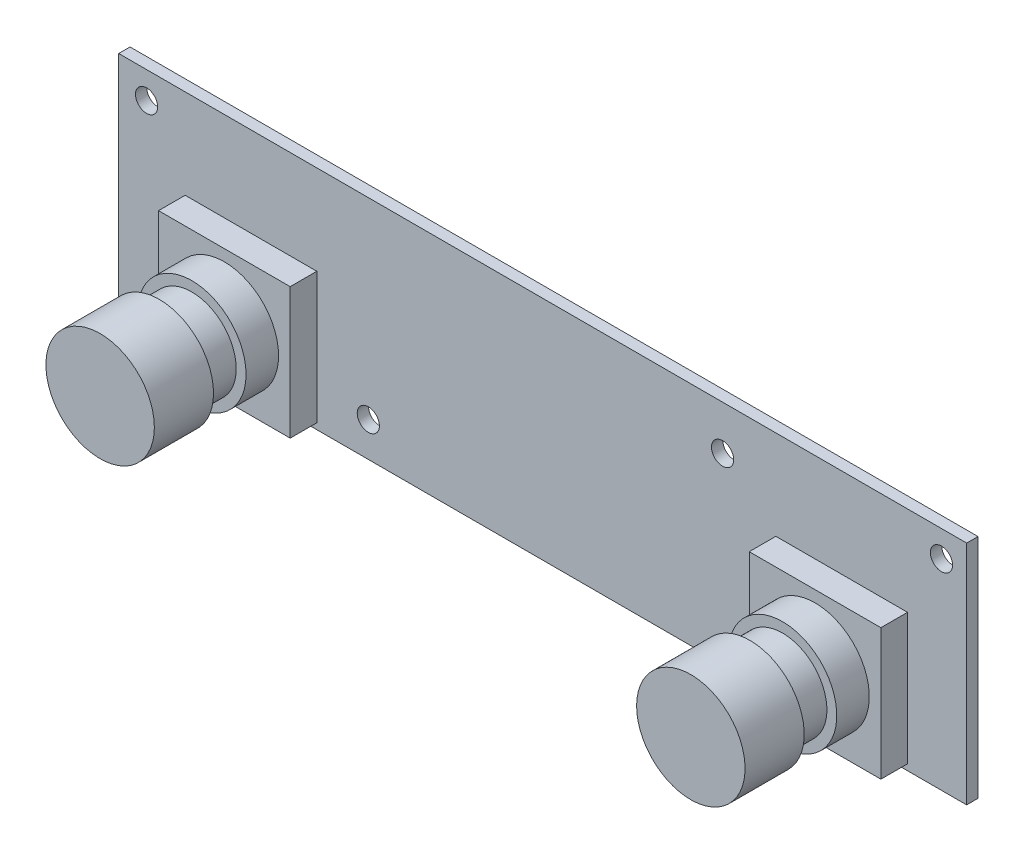
ISO-10303-21;
HEADER;
FILE_DESCRIPTION(('STEP AP214'),'2;1');
FILE_NAME('part.step','',(''),(''),'','','');
FILE_SCHEMA(('AUTOMOTIVE_DESIGN { 1 0 10303 214 1 1 1 1 }'));
ENDSEC;
DATA;
#1=APPLICATION_CONTEXT('core data for automotive mechanical design processes');
#2=APPLICATION_PROTOCOL_DEFINITION('international standard','automotive_design',2000,#1);
#3=PRODUCT_CONTEXT('',#1,'mechanical');
#4=PRODUCT('Part','Part','',(#3));
#5=PRODUCT_RELATED_PRODUCT_CATEGORY('part','',(#4));
#6=PRODUCT_DEFINITION_FORMATION('','',#4);
#7=PRODUCT_DEFINITION_CONTEXT('part definition',#1,'design');
#8=PRODUCT_DEFINITION('design','',#6,#7);
#9=PRODUCT_DEFINITION_SHAPE('','',#8);
#10=(LENGTH_UNIT() NAMED_UNIT(*) SI_UNIT(.MILLI.,.METRE.));
#11=(NAMED_UNIT(*) PLANE_ANGLE_UNIT() SI_UNIT($,.RADIAN.));
#12=(NAMED_UNIT(*) SI_UNIT($,.STERADIAN.) SOLID_ANGLE_UNIT());
#13=UNCERTAINTY_MEASURE_WITH_UNIT(LENGTH_MEASURE(1.E-05),#10,'distance_accuracy_value','');
#14=(GEOMETRIC_REPRESENTATION_CONTEXT(3) GLOBAL_UNCERTAINTY_ASSIGNED_CONTEXT((#13)) GLOBAL_UNIT_ASSIGNED_CONTEXT((#10,
#11,#12)) REPRESENTATION_CONTEXT('',''));
#15=CARTESIAN_POINT('',(0.,0.,0.));
#16=DIRECTION('',(0.,0.,1.));
#17=DIRECTION('',(1.,0.,0.));
#18=AXIS2_PLACEMENT_3D('',#15,#16,#17);
#19=CARTESIAN_POINT('',(0.,0.,0.));
#20=DIRECTION('',(0.,0.,1.));
#21=DIRECTION('',(1.,0.,0.));
#22=AXIS2_PLACEMENT_3D('',#19,#20,#21);
#23=PLANE('',#22);
#24=CARTESIAN_POINT('',(-40.175,8.775,0.));
#25=DIRECTION('',(0.,0.,1.));
#26=DIRECTION('',(1.,0.,0.));
#27=AXIS2_PLACEMENT_3D('',#24,#25,#26);
#28=CIRCLE('',#27,1.125);
#29=CARTESIAN_POINT('',(-39.05,8.775,0.));
#30=VERTEX_POINT('',#29);
#31=EDGE_CURVE('E310',#30,#30,#28,.T.);
#32=ORIENTED_EDGE('',*,*,#31,.F.);
#33=EDGE_LOOP('',(#32));
#34=FACE_BOUND('',#33,.T.);
#35=CARTESIAN_POINT('',(-17.685,-7.995,0.));
#36=DIRECTION('',(0.,0.,1.));
#37=DIRECTION('',(1.,0.,0.));
#38=AXIS2_PLACEMENT_3D('',#35,#36,#37);
#39=CIRCLE('',#38,1.125);
#40=CARTESIAN_POINT('',(-16.56,-7.995,0.));
#41=VERTEX_POINT('',#40);
#42=EDGE_CURVE('E314',#41,#41,#39,.T.);
#43=ORIENTED_EDGE('',*,*,#42,.F.);
#44=EDGE_LOOP('',(#43));
#45=FACE_BOUND('',#44,.T.);
#46=CARTESIAN_POINT('',(18.245,6.995,0.));
#47=DIRECTION('',(0.,0.,1.));
#48=DIRECTION('',(1.,0.,0.));
#49=AXIS2_PLACEMENT_3D('',#46,#47,#48);
#50=CIRCLE('',#49,1.125);
#51=CARTESIAN_POINT('',(19.37,6.995,0.));
#52=VERTEX_POINT('',#51);
#53=EDGE_CURVE('E318',#52,#52,#50,.T.);
#54=ORIENTED_EDGE('',*,*,#53,.F.);
#55=EDGE_LOOP('',(#54));
#56=FACE_BOUND('',#55,.T.);
#57=CARTESIAN_POINT('',(40.445,8.83576446590219,0.));
#58=DIRECTION('',(0.,0.,1.));
#59=DIRECTION('',(1.,0.,0.));
#60=AXIS2_PLACEMENT_3D('',#57,#58,#59);
#61=CIRCLE('',#60,1.125);
#62=CARTESIAN_POINT('',(41.57,8.83576446590219,0.));
#63=VERTEX_POINT('',#62);
#64=EDGE_CURVE('E322',#63,#63,#61,.T.);
#65=ORIENTED_EDGE('',*,*,#64,.F.);
#66=EDGE_LOOP('',(#65));
#67=FACE_BOUND('',#66,.T.);
#68=DIRECTION('',(1.,0.,0.));
#69=VECTOR('',#68,1.);
#70=CARTESIAN_POINT('',(-43.,11.5,0.));
#71=LINE('',#70,#69);
#72=CARTESIAN_POINT('',(-43.,11.5,0.));
#73=VERTEX_POINT('',#72);
#74=CARTESIAN_POINT('',(43.,11.5,0.));
#75=VERTEX_POINT('',#74);
#76=EDGE_CURVE('E204',#73,#75,#71,.T.);
#77=ORIENTED_EDGE('',*,*,#76,.F.);
#78=DIRECTION('',(0.,1.,0.));
#79=VECTOR('',#78,1.);
#80=CARTESIAN_POINT('',(-43.,-11.5,0.));
#81=LINE('',#80,#79);
#82=CARTESIAN_POINT('',(-43.,-11.5,0.));
#83=VERTEX_POINT('',#82);
#84=EDGE_CURVE('E209',#83,#73,#81,.T.);
#85=ORIENTED_EDGE('',*,*,#84,.F.);
#86=DIRECTION('',(1.,0.,0.));
#87=VECTOR('',#86,1.);
#88=CARTESIAN_POINT('',(-43.,-11.5,0.));
#89=LINE('',#88,#87);
#90=CARTESIAN_POINT('',(43.,-11.5,0.));
#91=VERTEX_POINT('',#90);
#92=EDGE_CURVE('E228',#83,#91,#89,.T.);
#93=ORIENTED_EDGE('',*,*,#92,.T.);
#94=DIRECTION('',(0.,1.,0.));
#95=VECTOR('',#94,1.);
#96=CARTESIAN_POINT('',(43.,-11.5,0.));
#97=LINE('',#96,#95);
#98=EDGE_CURVE('E224',#91,#75,#97,.T.);
#99=ORIENTED_EDGE('',*,*,#98,.T.);
#100=EDGE_LOOP('',(#77,#85,#93,#99));
#101=FACE_BOUND('',#100,.T.);
#102=DIRECTION('',(1.,0.,0.));
#103=VECTOR('',#102,1.);
#104=CARTESIAN_POINT('',(23.65,-10.8921619139473,0.));
#105=LINE('',#104,#103);
#106=CARTESIAN_POINT('',(23.65,-10.8921619139473,0.));
#107=VERTEX_POINT('',#106);
#108=CARTESIAN_POINT('',(37.,-10.8921619139473,0.));
#109=VERTEX_POINT('',#108);
#110=EDGE_CURVE('E165',#107,#109,#105,.T.);
#111=ORIENTED_EDGE('',*,*,#110,.F.);
#112=DIRECTION('',(0.,-1.,0.));
#113=VECTOR('',#112,1.);
#114=CARTESIAN_POINT('',(23.65,2.41783808605268,0.));
#115=LINE('',#114,#113);
#116=CARTESIAN_POINT('',(23.65,2.41783808605268,0.));
#117=VERTEX_POINT('',#116);
#118=EDGE_CURVE('E160',#117,#107,#115,.T.);
#119=ORIENTED_EDGE('',*,*,#118,.F.);
#120=DIRECTION('',(-1.,0.,0.));
#121=VECTOR('',#120,1.);
#122=CARTESIAN_POINT('',(23.65,2.41783808605268,0.));
#123=LINE('',#122,#121);
#124=CARTESIAN_POINT('',(37.,2.41783808605268,0.));
#125=VERTEX_POINT('',#124);
#126=EDGE_CURVE('E175',#125,#117,#123,.T.);
#127=ORIENTED_EDGE('',*,*,#126,.F.);
#128=DIRECTION('',(0.,1.,0.));
#129=VECTOR('',#128,1.);
#130=CARTESIAN_POINT('',(37.,2.41783808605268,0.));
#131=LINE('',#130,#129);
#132=EDGE_CURVE('E187',#109,#125,#131,.T.);
#133=ORIENTED_EDGE('',*,*,#132,.F.);
#134=EDGE_LOOP('',(#111,#119,#127,#133));
#135=FACE_BOUND('',#134,.T.);
#136=DIRECTION('',(1.,0.,0.));
#137=VECTOR('',#136,1.);
#138=CARTESIAN_POINT('',(-36.26,-10.8921619139473,0.));
#139=LINE('',#138,#137);
#140=CARTESIAN_POINT('',(-36.26,-10.8921619139473,0.));
#141=VERTEX_POINT('',#140);
#142=CARTESIAN_POINT('',(-22.91,-10.8921619139473,0.));
#143=VERTEX_POINT('',#142);
#144=EDGE_CURVE('E262',#141,#143,#139,.T.);
#145=ORIENTED_EDGE('',*,*,#144,.F.);
#146=DIRECTION('',(0.,-1.,0.));
#147=VECTOR('',#146,1.);
#148=CARTESIAN_POINT('',(-36.26,2.41783808605268,0.));
#149=LINE('',#148,#147);
#150=CARTESIAN_POINT('',(-36.26,2.41783808605268,0.));
#151=VERTEX_POINT('',#150);
#152=EDGE_CURVE('E157',#151,#141,#149,.T.);
#153=ORIENTED_EDGE('',*,*,#152,.F.);
#154=DIRECTION('',(-1.,0.,0.));
#155=VECTOR('',#154,1.);
#156=CARTESIAN_POINT('',(-36.26,2.41783808605268,0.));
#157=LINE('',#156,#155);
#158=CARTESIAN_POINT('',(-22.91,2.41783808605268,0.));
#159=VERTEX_POINT('',#158);
#160=EDGE_CURVE('E153',#159,#151,#157,.T.);
#161=ORIENTED_EDGE('',*,*,#160,.F.);
#162=DIRECTION('',(0.,1.,0.));
#163=VECTOR('',#162,1.);
#164=CARTESIAN_POINT('',(-22.91,2.41783808605268,0.));
#165=LINE('',#164,#163);
#166=EDGE_CURVE('E265',#143,#159,#165,.T.);
#167=ORIENTED_EDGE('',*,*,#166,.F.);
#168=EDGE_LOOP('',(#145,#153,#161,#167));
#169=FACE_BOUND('',#168,.T.);
#170=ADVANCED_FACE('F39',(#34,#45,#56,#67,#101,#135,#169),#23,.T.);
#171=CARTESIAN_POINT('',(-43.,11.5,-1.15));
#172=DIRECTION('',(0.,-1.,0.));
#173=DIRECTION('',(0.,0.,-1.));
#174=AXIS2_PLACEMENT_3D('',#171,#172,#173);
#175=PLANE('',#174);
#176=ORIENTED_EDGE('',*,*,#76,.T.);
#177=DIRECTION('',(0.,0.,1.));
#178=VECTOR('',#177,1.);
#179=CARTESIAN_POINT('',(43.,11.5,-1.15));
#180=LINE('',#179,#178);
#181=CARTESIAN_POINT('',(43.,11.5,-1.15));
#182=VERTEX_POINT('',#181);
#183=EDGE_CURVE('E43',#182,#75,#180,.T.);
#184=ORIENTED_EDGE('',*,*,#183,.F.);
#185=DIRECTION('',(1.,0.,0.));
#186=VECTOR('',#185,1.);
#187=CARTESIAN_POINT('',(-43.,11.5,-1.15));
#188=LINE('',#187,#186);
#189=CARTESIAN_POINT('',(-43.,11.5,-1.15));
#190=VERTEX_POINT('',#189);
#191=EDGE_CURVE('E205',#190,#182,#188,.T.);
#192=ORIENTED_EDGE('',*,*,#191,.F.);
#193=DIRECTION('',(0.,0.,1.));
#194=VECTOR('',#193,1.);
#195=CARTESIAN_POINT('',(-43.,11.5,-1.15));
#196=LINE('',#195,#194);
#197=EDGE_CURVE('E220',#190,#73,#196,.T.);
#198=ORIENTED_EDGE('',*,*,#197,.T.);
#199=EDGE_LOOP('',(#176,#184,#192,#198));
#200=FACE_BOUND('',#199,.T.);
#201=ADVANCED_FACE('F41',(#200),#175,.F.);
#202=CARTESIAN_POINT('',(43.,-11.5,-1.15));
#203=DIRECTION('',(1.,0.,0.));
#204=DIRECTION('',(0.,0.,-1.));
#205=AXIS2_PLACEMENT_3D('',#202,#203,#204);
#206=PLANE('',#205);
#207=ORIENTED_EDGE('',*,*,#98,.F.);
#208=DIRECTION('',(0.,0.,1.));
#209=VECTOR('',#208,1.);
#210=CARTESIAN_POINT('',(43.,-11.5,-1.15));
#211=LINE('',#210,#209);
#212=CARTESIAN_POINT('',(43.,-11.5,-1.15));
#213=VERTEX_POINT('',#212);
#214=EDGE_CURVE('E239',#213,#91,#211,.T.);
#215=ORIENTED_EDGE('',*,*,#214,.F.);
#216=DIRECTION('',(0.,1.,0.));
#217=VECTOR('',#216,1.);
#218=CARTESIAN_POINT('',(43.,-11.5,-1.15));
#219=LINE('',#218,#217);
#220=EDGE_CURVE('E208',#213,#182,#219,.T.);
#221=ORIENTED_EDGE('',*,*,#220,.T.);
#222=ORIENTED_EDGE('',*,*,#183,.T.);
#223=EDGE_LOOP('',(#207,#215,#221,#222));
#224=FACE_BOUND('',#223,.T.);
#225=ADVANCED_FACE('F360',(#224),#206,.T.);
#226=CARTESIAN_POINT('',(-43.,-11.5,-1.15));
#227=DIRECTION('',(0.,-1.,0.));
#228=DIRECTION('',(0.,0.,-1.));
#229=AXIS2_PLACEMENT_3D('',#226,#227,#228);
#230=PLANE('',#229);
#231=ORIENTED_EDGE('',*,*,#92,.F.);
#232=DIRECTION('',(0.,0.,1.));
#233=VECTOR('',#232,1.);
#234=CARTESIAN_POINT('',(-43.,-11.5,-1.15));
#235=LINE('',#234,#233);
#236=CARTESIAN_POINT('',(-43.,-11.5,-1.15));
#237=VERTEX_POINT('',#236);
#238=EDGE_CURVE('E237',#237,#83,#235,.T.);
#239=ORIENTED_EDGE('',*,*,#238,.F.);
#240=DIRECTION('',(1.,0.,0.));
#241=VECTOR('',#240,1.);
#242=CARTESIAN_POINT('',(-43.,-11.5,-1.15));
#243=LINE('',#242,#241);
#244=EDGE_CURVE('E213',#237,#213,#243,.T.);
#245=ORIENTED_EDGE('',*,*,#244,.T.);
#246=ORIENTED_EDGE('',*,*,#214,.T.);
#247=EDGE_LOOP('',(#231,#239,#245,#246));
#248=FACE_BOUND('',#247,.T.);
#249=ADVANCED_FACE('F364',(#248),#230,.T.);
#250=CARTESIAN_POINT('',(-43.,-11.5,-1.15));
#251=DIRECTION('',(1.,0.,0.));
#252=DIRECTION('',(0.,0.,-1.));
#253=AXIS2_PLACEMENT_3D('',#250,#251,#252);
#254=PLANE('',#253);
#255=ORIENTED_EDGE('',*,*,#84,.T.);
#256=ORIENTED_EDGE('',*,*,#197,.F.);
#257=DIRECTION('',(0.,1.,0.));
#258=VECTOR('',#257,1.);
#259=CARTESIAN_POINT('',(-43.,-11.5,-1.15));
#260=LINE('',#259,#258);
#261=EDGE_CURVE('E217',#237,#190,#260,.T.);
#262=ORIENTED_EDGE('',*,*,#261,.F.);
#263=ORIENTED_EDGE('',*,*,#238,.T.);
#264=EDGE_LOOP('',(#255,#256,#262,#263));
#265=FACE_BOUND('',#264,.T.);
#266=ADVANCED_FACE('F350',(#265),#254,.F.);
#267=CARTESIAN_POINT('',(0.,0.,-1.15));
#268=DIRECTION('',(0.,0.,1.));
#269=DIRECTION('',(1.,0.,0.));
#270=AXIS2_PLACEMENT_3D('',#267,#268,#269);
#271=PLANE('',#270);
#272=CARTESIAN_POINT('',(-40.175,8.775,-1.15));
#273=DIRECTION('',(0.,0.,-1.));
#274=DIRECTION('',(-1.,0.,0.));
#275=AXIS2_PLACEMENT_3D('',#272,#273,#274);
#276=CIRCLE('',#275,1.125);
#277=CARTESIAN_POINT('',(-41.3,8.775,-1.15));
#278=VERTEX_POINT('',#277);
#279=EDGE_CURVE('E326',#278,#278,#276,.T.);
#280=ORIENTED_EDGE('',*,*,#279,.F.);
#281=EDGE_LOOP('',(#280));
#282=FACE_BOUND('',#281,.T.);
#283=CARTESIAN_POINT('',(-17.685,-7.995,-1.15));
#284=DIRECTION('',(0.,0.,-1.));
#285=DIRECTION('',(-1.,0.,0.));
#286=AXIS2_PLACEMENT_3D('',#283,#284,#285);
#287=CIRCLE('',#286,1.125);
#288=CARTESIAN_POINT('',(-18.81,-7.995,-1.15));
#289=VERTEX_POINT('',#288);
#290=EDGE_CURVE('E330',#289,#289,#287,.T.);
#291=ORIENTED_EDGE('',*,*,#290,.F.);
#292=EDGE_LOOP('',(#291));
#293=FACE_BOUND('',#292,.T.);
#294=CARTESIAN_POINT('',(18.245,6.995,-1.15));
#295=DIRECTION('',(0.,0.,-1.));
#296=DIRECTION('',(-1.,0.,0.));
#297=AXIS2_PLACEMENT_3D('',#294,#295,#296);
#298=CIRCLE('',#297,1.125);
#299=CARTESIAN_POINT('',(17.12,6.995,-1.15));
#300=VERTEX_POINT('',#299);
#301=EDGE_CURVE('E334',#300,#300,#298,.T.);
#302=ORIENTED_EDGE('',*,*,#301,.F.);
#303=EDGE_LOOP('',(#302));
#304=FACE_BOUND('',#303,.T.);
#305=CARTESIAN_POINT('',(40.445,8.83576446590219,-1.15));
#306=DIRECTION('',(0.,0.,-1.));
#307=DIRECTION('',(-1.,0.,0.));
#308=AXIS2_PLACEMENT_3D('',#305,#306,#307);
#309=CIRCLE('',#308,1.125);
#310=CARTESIAN_POINT('',(39.32,8.83576446590219,-1.15));
#311=VERTEX_POINT('',#310);
#312=EDGE_CURVE('E338',#311,#311,#309,.T.);
#313=ORIENTED_EDGE('',*,*,#312,.F.);
#314=EDGE_LOOP('',(#313));
#315=FACE_BOUND('',#314,.T.);
#316=ORIENTED_EDGE('',*,*,#191,.T.);
#317=ORIENTED_EDGE('',*,*,#220,.F.);
#318=ORIENTED_EDGE('',*,*,#244,.F.);
#319=ORIENTED_EDGE('',*,*,#261,.T.);
#320=EDGE_LOOP('',(#316,#317,#318,#319));
#321=FACE_BOUND('',#320,.T.);
#322=ADVANCED_FACE('F346',(#282,#293,#304,#315,#321),#271,.F.);
#323=CARTESIAN_POINT('',(23.65,2.41783808605268,2.7));
#324=DIRECTION('',(1.,0.,0.));
#325=DIRECTION('',(0.,0.,-1.));
#326=AXIS2_PLACEMENT_3D('',#323,#324,#325);
#327=PLANE('',#326);
#328=ORIENTED_EDGE('',*,*,#118,.T.);
#329=DIRECTION('',(0.,0.,-1.));
#330=VECTOR('',#329,1.);
#331=CARTESIAN_POINT('',(23.65,-10.8921619139473,2.7));
#332=LINE('',#331,#330);
#333=CARTESIAN_POINT('',(23.65,-10.8921619139473,2.7));
#334=VERTEX_POINT('',#333);
#335=EDGE_CURVE('E201',#334,#107,#332,.T.);
#336=ORIENTED_EDGE('',*,*,#335,.F.);
#337=DIRECTION('',(0.,-1.,0.));
#338=VECTOR('',#337,1.);
#339=CARTESIAN_POINT('',(23.65,2.41783808605268,2.7));
#340=LINE('',#339,#338);
#341=CARTESIAN_POINT('',(23.65,2.41783808605268,2.7));
#342=VERTEX_POINT('',#341);
#343=EDGE_CURVE('E170',#342,#334,#340,.T.);
#344=ORIENTED_EDGE('',*,*,#343,.F.);
#345=DIRECTION('',(0.,0.,-1.));
#346=VECTOR('',#345,1.);
#347=CARTESIAN_POINT('',(23.65,2.41783808605268,2.7));
#348=LINE('',#347,#346);
#349=EDGE_CURVE('E183',#342,#117,#348,.T.);
#350=ORIENTED_EDGE('',*,*,#349,.T.);
#351=EDGE_LOOP('',(#328,#336,#344,#350));
#352=FACE_BOUND('',#351,.T.);
#353=ADVANCED_FACE('F349',(#352),#327,.F.);
#354=CARTESIAN_POINT('',(23.65,-10.8921619139473,2.7));
#355=DIRECTION('',(0.,1.,0.));
#356=DIRECTION('',(0.,0.,1.));
#357=AXIS2_PLACEMENT_3D('',#354,#355,#356);
#358=PLANE('',#357);
#359=ORIENTED_EDGE('',*,*,#110,.T.);
#360=DIRECTION('',(0.,0.,-1.));
#361=VECTOR('',#360,1.);
#362=CARTESIAN_POINT('',(37.,-10.8921619139473,2.7));
#363=LINE('',#362,#361);
#364=CARTESIAN_POINT('',(37.,-10.8921619139473,2.7));
#365=VERTEX_POINT('',#364);
#366=EDGE_CURVE('E197',#365,#109,#363,.T.);
#367=ORIENTED_EDGE('',*,*,#366,.F.);
#368=DIRECTION('',(1.,0.,0.));
#369=VECTOR('',#368,1.);
#370=CARTESIAN_POINT('',(23.65,-10.8921619139473,2.7));
#371=LINE('',#370,#369);
#372=EDGE_CURVE('E174',#334,#365,#371,.T.);
#373=ORIENTED_EDGE('',*,*,#372,.F.);
#374=ORIENTED_EDGE('',*,*,#335,.T.);
#375=EDGE_LOOP('',(#359,#367,#373,#374));
#376=FACE_BOUND('',#375,.T.);
#377=ADVANCED_FACE('F383',(#376),#358,.F.);
#378=CARTESIAN_POINT('',(37.,2.41783808605268,2.7));
#379=DIRECTION('',(-1.,0.,0.));
#380=DIRECTION('',(0.,0.,1.));
#381=AXIS2_PLACEMENT_3D('',#378,#379,#380);
#382=PLANE('',#381);
#383=ORIENTED_EDGE('',*,*,#132,.T.);
#384=DIRECTION('',(0.,0.,-1.));
#385=VECTOR('',#384,1.);
#386=CARTESIAN_POINT('',(37.,2.41783808605268,2.7));
#387=LINE('',#386,#385);
#388=CARTESIAN_POINT('',(37.,2.41783808605268,2.7));
#389=VERTEX_POINT('',#388);
#390=EDGE_CURVE('E65',#389,#125,#387,.T.);
#391=ORIENTED_EDGE('',*,*,#390,.F.);
#392=DIRECTION('',(0.,1.,0.));
#393=VECTOR('',#392,1.);
#394=CARTESIAN_POINT('',(37.,2.41783808605268,2.7));
#395=LINE('',#394,#393);
#396=EDGE_CURVE('E178',#365,#389,#395,.T.);
#397=ORIENTED_EDGE('',*,*,#396,.F.);
#398=ORIENTED_EDGE('',*,*,#366,.T.);
#399=EDGE_LOOP('',(#383,#391,#397,#398));
#400=FACE_BOUND('',#399,.T.);
#401=ADVANCED_FACE('F387',(#400),#382,.F.);
#402=CARTESIAN_POINT('',(23.65,2.41783808605268,2.7));
#403=DIRECTION('',(0.,-1.,0.));
#404=DIRECTION('',(1.,0.,0.));
#405=AXIS2_PLACEMENT_3D('',#402,#403,#404);
#406=PLANE('',#405);
#407=ORIENTED_EDGE('',*,*,#126,.T.);
#408=ORIENTED_EDGE('',*,*,#349,.F.);
#409=DIRECTION('',(-1.,0.,0.));
#410=VECTOR('',#409,1.);
#411=CARTESIAN_POINT('',(23.65,2.41783808605268,2.7));
#412=LINE('',#411,#410);
#413=EDGE_CURVE('E181',#389,#342,#412,.T.);
#414=ORIENTED_EDGE('',*,*,#413,.F.);
#415=ORIENTED_EDGE('',*,*,#390,.T.);
#416=EDGE_LOOP('',(#407,#408,#414,#415));
#417=FACE_BOUND('',#416,.T.);
#418=ADVANCED_FACE('F391',(#417),#406,.F.);
#419=CARTESIAN_POINT('',(0.,0.,2.7));
#420=DIRECTION('',(0.,0.,1.));
#421=DIRECTION('',(1.,0.,0.));
#422=AXIS2_PLACEMENT_3D('',#419,#420,#421);
#423=PLANE('',#422);
#424=CARTESIAN_POINT('',(30.325,-4.23716191394732,2.7));
#425=DIRECTION('',(0.,0.,-1.));
#426=DIRECTION('',(-1.,0.,0.));
#427=AXIS2_PLACEMENT_3D('',#424,#425,#426);
#428=CIRCLE('',#427,5.5);
#429=CARTESIAN_POINT('',(24.825,-4.23716191394732,2.7));
#430=VERTEX_POINT('',#429);
#431=EDGE_CURVE('E290',#430,#430,#428,.T.);
#432=ORIENTED_EDGE('',*,*,#431,.T.);
#433=EDGE_LOOP('',(#432));
#434=FACE_BOUND('',#433,.T.);
#435=ORIENTED_EDGE('',*,*,#343,.T.);
#436=ORIENTED_EDGE('',*,*,#372,.T.);
#437=ORIENTED_EDGE('',*,*,#396,.T.);
#438=ORIENTED_EDGE('',*,*,#413,.T.);
#439=EDGE_LOOP('',(#435,#436,#437,#438));
#440=FACE_BOUND('',#439,.T.);
#441=ADVANCED_FACE('F395',(#434,#440),#423,.T.);
#442=CARTESIAN_POINT('',(-36.26,2.41783808605268,2.7));
#443=DIRECTION('',(1.,0.,0.));
#444=DIRECTION('',(0.,0.,-1.));
#445=AXIS2_PLACEMENT_3D('',#442,#443,#444);
#446=PLANE('',#445);
#447=ORIENTED_EDGE('',*,*,#152,.T.);
#448=DIRECTION('',(0.,0.,-1.));
#449=VECTOR('',#448,1.);
#450=CARTESIAN_POINT('',(-36.26,-10.8921619139473,2.7));
#451=LINE('',#450,#449);
#452=CARTESIAN_POINT('',(-36.26,-10.8921619139473,2.7));
#453=VERTEX_POINT('',#452);
#454=EDGE_CURVE('E136',#453,#141,#451,.T.);
#455=ORIENTED_EDGE('',*,*,#454,.F.);
#456=DIRECTION('',(0.,-1.,0.));
#457=VECTOR('',#456,1.);
#458=CARTESIAN_POINT('',(-36.26,2.41783808605268,2.7));
#459=LINE('',#458,#457);
#460=CARTESIAN_POINT('',(-36.26,2.41783808605268,2.7));
#461=VERTEX_POINT('',#460);
#462=EDGE_CURVE('E144',#461,#453,#459,.T.);
#463=ORIENTED_EDGE('',*,*,#462,.F.);
#464=DIRECTION('',(0.,0.,-1.));
#465=VECTOR('',#464,1.);
#466=CARTESIAN_POINT('',(-36.26,2.41783808605268,2.7));
#467=LINE('',#466,#465);
#468=EDGE_CURVE('E259',#461,#151,#467,.T.);
#469=ORIENTED_EDGE('',*,*,#468,.T.);
#470=EDGE_LOOP('',(#447,#455,#463,#469));
#471=FACE_BOUND('',#470,.T.);
#472=ADVANCED_FACE('F155',(#471),#446,.F.);
#473=CARTESIAN_POINT('',(-36.26,-10.8921619139473,2.7));
#474=DIRECTION('',(0.,1.,0.));
#475=DIRECTION('',(0.,0.,1.));
#476=AXIS2_PLACEMENT_3D('',#473,#474,#475);
#477=PLANE('',#476);
#478=ORIENTED_EDGE('',*,*,#144,.T.);
#479=DIRECTION('',(0.,0.,-1.));
#480=VECTOR('',#479,1.);
#481=CARTESIAN_POINT('',(-22.91,-10.8921619139473,2.7));
#482=LINE('',#481,#480);
#483=CARTESIAN_POINT('',(-22.91,-10.8921619139473,2.7));
#484=VERTEX_POINT('',#483);
#485=EDGE_CURVE('E139',#484,#143,#482,.T.);
#486=ORIENTED_EDGE('',*,*,#485,.F.);
#487=DIRECTION('',(1.,0.,0.));
#488=VECTOR('',#487,1.);
#489=CARTESIAN_POINT('',(-36.26,-10.8921619139473,2.7));
#490=LINE('',#489,#488);
#491=EDGE_CURVE('E132',#453,#484,#490,.T.);
#492=ORIENTED_EDGE('',*,*,#491,.F.);
#493=ORIENTED_EDGE('',*,*,#454,.T.);
#494=EDGE_LOOP('',(#478,#486,#492,#493));
#495=FACE_BOUND('',#494,.T.);
#496=ADVANCED_FACE('F134',(#495),#477,.F.);
#497=CARTESIAN_POINT('',(-22.91,2.41783808605268,2.7));
#498=DIRECTION('',(-1.,0.,0.));
#499=DIRECTION('',(0.,0.,1.));
#500=AXIS2_PLACEMENT_3D('',#497,#498,#499);
#501=PLANE('',#500);
#502=ORIENTED_EDGE('',*,*,#166,.T.);
#503=DIRECTION('',(0.,0.,-1.));
#504=VECTOR('',#503,1.);
#505=CARTESIAN_POINT('',(-22.91,2.41783808605268,2.7));
#506=LINE('',#505,#504);
#507=CARTESIAN_POINT('',(-22.91,2.41783808605268,2.7));
#508=VERTEX_POINT('',#507);
#509=EDGE_CURVE('E57',#508,#159,#506,.T.);
#510=ORIENTED_EDGE('',*,*,#509,.F.);
#511=DIRECTION('',(0.,1.,0.));
#512=VECTOR('',#511,1.);
#513=CARTESIAN_POINT('',(-22.91,2.41783808605268,2.7));
#514=LINE('',#513,#512);
#515=EDGE_CURVE('E143',#484,#508,#514,.T.);
#516=ORIENTED_EDGE('',*,*,#515,.F.);
#517=ORIENTED_EDGE('',*,*,#485,.T.);
#518=EDGE_LOOP('',(#502,#510,#516,#517));
#519=FACE_BOUND('',#518,.T.);
#520=ADVANCED_FACE('F403',(#519),#501,.F.);
#521=CARTESIAN_POINT('',(-36.26,2.41783808605268,2.7));
#522=DIRECTION('',(0.,-1.,0.));
#523=DIRECTION('',(0.,0.,-1.));
#524=AXIS2_PLACEMENT_3D('',#521,#522,#523);
#525=PLANE('',#524);
#526=ORIENTED_EDGE('',*,*,#160,.T.);
#527=ORIENTED_EDGE('',*,*,#468,.F.);
#528=DIRECTION('',(-1.,0.,0.));
#529=VECTOR('',#528,1.);
#530=CARTESIAN_POINT('',(-36.26,2.41783808605268,2.7));
#531=LINE('',#530,#529);
#532=EDGE_CURVE('E148',#508,#461,#531,.T.);
#533=ORIENTED_EDGE('',*,*,#532,.F.);
#534=ORIENTED_EDGE('',*,*,#509,.T.);
#535=EDGE_LOOP('',(#526,#527,#533,#534));
#536=FACE_BOUND('',#535,.T.);
#537=ADVANCED_FACE('F406',(#536),#525,.F.);
#538=CARTESIAN_POINT('',(0.,0.,2.7));
#539=DIRECTION('',(0.,0.,1.));
#540=DIRECTION('',(1.,0.,0.));
#541=AXIS2_PLACEMENT_3D('',#538,#539,#540);
#542=PLANE('',#541);
#543=CARTESIAN_POINT('',(-29.585,-4.23716191394732,2.7));
#544=DIRECTION('',(0.,0.,1.));
#545=DIRECTION('',(1.,0.,0.));
#546=AXIS2_PLACEMENT_3D('',#543,#544,#545);
#547=CIRCLE('',#546,5.5);
#548=CARTESIAN_POINT('',(-24.085,-4.23716191394732,2.7));
#549=VERTEX_POINT('',#548);
#550=EDGE_CURVE('E49',#549,#549,#547,.T.);
#551=ORIENTED_EDGE('',*,*,#550,.F.);
#552=EDGE_LOOP('',(#551));
#553=FACE_BOUND('',#552,.T.);
#554=ORIENTED_EDGE('',*,*,#462,.T.);
#555=ORIENTED_EDGE('',*,*,#491,.T.);
#556=ORIENTED_EDGE('',*,*,#515,.T.);
#557=ORIENTED_EDGE('',*,*,#532,.T.);
#558=EDGE_LOOP('',(#554,#555,#556,#557));
#559=FACE_BOUND('',#558,.T.);
#560=ADVANCED_FACE('F147',(#553,#559),#542,.T.);
#561=CARTESIAN_POINT('',(-29.585,-4.23716191394732,6.));
#562=DIRECTION('',(0.,0.,-1.));
#563=DIRECTION('',(-1.,0.,0.));
#564=AXIS2_PLACEMENT_3D('',#561,#562,#563);
#565=CYLINDRICAL_SURFACE('',#564,5.5);
#566=CARTESIAN_POINT('',(-29.585,-4.23716191394732,6.));
#567=DIRECTION('',(0.,0.,1.));
#568=DIRECTION('',(1.,0.,0.));
#569=AXIS2_PLACEMENT_3D('',#566,#567,#568);
#570=CIRCLE('',#569,5.5);
#571=CARTESIAN_POINT('',(-24.085,-4.23716191394732,6.));
#572=VERTEX_POINT('',#571);
#573=EDGE_CURVE('E253',#572,#572,#570,.T.);
#574=ORIENTED_EDGE('',*,*,#573,.F.);
#575=EDGE_LOOP('',(#574));
#576=FACE_BOUND('',#575,.T.);
#577=ORIENTED_EDGE('',*,*,#550,.T.);
#578=EDGE_LOOP('',(#577));
#579=FACE_BOUND('',#578,.T.);
#580=ADVANCED_FACE('F412',(#576,#579),#565,.T.);
#581=CARTESIAN_POINT('',(-29.585,-4.23716191394732,6.));
#582=DIRECTION('',(0.,0.,1.));
#583=DIRECTION('',(1.,0.,0.));
#584=AXIS2_PLACEMENT_3D('',#581,#582,#583);
#585=PLANE('',#584);
#586=CARTESIAN_POINT('',(-29.585,-4.23716191394732,6.));
#587=DIRECTION('',(0.,0.,1.));
#588=DIRECTION('',(1.,0.,0.));
#589=AXIS2_PLACEMENT_3D('',#586,#587,#588);
#590=CIRCLE('',#589,4.5);
#591=CARTESIAN_POINT('',(-25.085,-4.23716191394732,6.));
#592=VERTEX_POINT('',#591);
#593=EDGE_CURVE('E11',#592,#592,#590,.T.);
#594=ORIENTED_EDGE('',*,*,#593,.F.);
#595=EDGE_LOOP('',(#594));
#596=FACE_BOUND('',#595,.T.);
#597=ORIENTED_EDGE('',*,*,#573,.T.);
#598=EDGE_LOOP('',(#597));
#599=FACE_BOUND('',#598,.T.);
#600=ADVANCED_FACE('F416',(#596,#599),#585,.T.);
#601=CARTESIAN_POINT('',(-29.585,-4.23716191394732,9.3));
#602=DIRECTION('',(0.,0.,-1.));
#603=DIRECTION('',(-1.,0.,0.));
#604=AXIS2_PLACEMENT_3D('',#601,#602,#603);
#605=CYLINDRICAL_SURFACE('',#604,4.5);
#606=CARTESIAN_POINT('',(-29.585,-4.23716191394732,9.3));
#607=DIRECTION('',(0.,0.,1.));
#608=DIRECTION('',(1.,0.,0.));
#609=AXIS2_PLACEMENT_3D('',#606,#607,#608);
#610=CIRCLE('',#609,4.5);
#611=CARTESIAN_POINT('',(-25.085,-4.23716191394732,9.3));
#612=VERTEX_POINT('',#611);
#613=EDGE_CURVE('E275',#612,#612,#610,.T.);
#614=ORIENTED_EDGE('',*,*,#613,.F.);
#615=EDGE_LOOP('',(#614));
#616=FACE_BOUND('',#615,.T.);
#617=ORIENTED_EDGE('',*,*,#593,.T.);
#618=EDGE_LOOP('',(#617));
#619=FACE_BOUND('',#618,.T.);
#620=ADVANCED_FACE('F420',(#616,#619),#605,.T.);
#621=CARTESIAN_POINT('',(-29.585,-4.23716191394732,15.3));
#622=DIRECTION('',(0.,0.,-1.));
#623=DIRECTION('',(-1.,0.,0.));
#624=AXIS2_PLACEMENT_3D('',#621,#622,#623);
#625=CYLINDRICAL_SURFACE('',#624,5.5);
#626=CARTESIAN_POINT('',(-29.585,-4.23716191394732,15.3));
#627=DIRECTION('',(0.,0.,1.));
#628=DIRECTION('',(1.,0.,0.));
#629=AXIS2_PLACEMENT_3D('',#626,#627,#628);
#630=CIRCLE('',#629,5.5);
#631=CARTESIAN_POINT('',(-24.085,-4.23716191394732,15.3));
#632=VERTEX_POINT('',#631);
#633=EDGE_CURVE('E278',#632,#632,#630,.T.);
#634=ORIENTED_EDGE('',*,*,#633,.F.);
#635=EDGE_LOOP('',(#634));
#636=FACE_BOUND('',#635,.T.);
#637=CARTESIAN_POINT('',(-29.585,-4.23716191394732,9.3));
#638=DIRECTION('',(0.,0.,1.));
#639=DIRECTION('',(1.,0.,0.));
#640=AXIS2_PLACEMENT_3D('',#637,#638,#639);
#641=CIRCLE('',#640,5.5);
#642=CARTESIAN_POINT('',(-24.085,-4.23716191394732,9.3));
#643=VERTEX_POINT('',#642);
#644=EDGE_CURVE('E282',#643,#643,#641,.T.);
#645=ORIENTED_EDGE('',*,*,#644,.T.);
#646=EDGE_LOOP('',(#645));
#647=FACE_BOUND('',#646,.T.);
#648=ADVANCED_FACE('F424',(#636,#647),#625,.T.);
#649=CARTESIAN_POINT('',(-29.585,-4.23716191394732,15.3));
#650=DIRECTION('',(0.,0.,1.));
#651=DIRECTION('',(1.,0.,0.));
#652=AXIS2_PLACEMENT_3D('',#649,#650,#651);
#653=PLANE('',#652);
#654=ORIENTED_EDGE('',*,*,#633,.T.);
#655=EDGE_LOOP('',(#654));
#656=FACE_BOUND('',#655,.T.);
#657=ADVANCED_FACE('F428',(#656),#653,.T.);
#658=CARTESIAN_POINT('',(-29.585,-4.23716191394732,9.3));
#659=DIRECTION('',(0.,0.,1.));
#660=DIRECTION('',(1.,0.,0.));
#661=AXIS2_PLACEMENT_3D('',#658,#659,#660);
#662=PLANE('',#661);
#663=ORIENTED_EDGE('',*,*,#613,.T.);
#664=EDGE_LOOP('',(#663));
#665=FACE_BOUND('',#664,.T.);
#666=ORIENTED_EDGE('',*,*,#644,.F.);
#667=EDGE_LOOP('',(#666));
#668=FACE_BOUND('',#667,.T.);
#669=ADVANCED_FACE('F430',(#665,#668),#662,.F.);
#670=CARTESIAN_POINT('',(30.325,-4.23716191394732,6.));
#671=DIRECTION('',(0.,0.,-1.));
#672=DIRECTION('',(-1.,0.,0.));
#673=AXIS2_PLACEMENT_3D('',#670,#671,#672);
#674=CYLINDRICAL_SURFACE('',#673,5.5);
#675=CARTESIAN_POINT('',(30.325,-4.23716191394732,6.));
#676=DIRECTION('',(0.,0.,-1.));
#677=DIRECTION('',(-1.,0.,0.));
#678=AXIS2_PLACEMENT_3D('',#675,#676,#677);
#679=CIRCLE('',#678,5.5);
#680=CARTESIAN_POINT('',(24.825,-4.23716191394732,6.));
#681=VERTEX_POINT('',#680);
#682=EDGE_CURVE('E286',#681,#681,#679,.T.);
#683=ORIENTED_EDGE('',*,*,#682,.T.);
#684=EDGE_LOOP('',(#683));
#685=FACE_BOUND('',#684,.T.);
#686=ORIENTED_EDGE('',*,*,#431,.F.);
#687=EDGE_LOOP('',(#686));
#688=FACE_BOUND('',#687,.T.);
#689=ADVANCED_FACE('F433',(#685,#688),#674,.T.);
#690=CARTESIAN_POINT('',(30.325,-4.23716191394732,6.));
#691=DIRECTION('',(0.,0.,1.));
#692=DIRECTION('',(-1.,0.,0.));
#693=AXIS2_PLACEMENT_3D('',#690,#691,#692);
#694=PLANE('',#693);
#695=CARTESIAN_POINT('',(30.325,-4.23716191394732,6.));
#696=DIRECTION('',(0.,0.,-1.));
#697=DIRECTION('',(-1.,0.,0.));
#698=AXIS2_PLACEMENT_3D('',#695,#696,#697);
#699=CIRCLE('',#698,4.5);
#700=CARTESIAN_POINT('',(25.825,-4.23716191394732,6.));
#701=VERTEX_POINT('',#700);
#702=EDGE_CURVE('E294',#701,#701,#699,.T.);
#703=ORIENTED_EDGE('',*,*,#702,.T.);
#704=EDGE_LOOP('',(#703));
#705=FACE_BOUND('',#704,.T.);
#706=ORIENTED_EDGE('',*,*,#682,.F.);
#707=EDGE_LOOP('',(#706));
#708=FACE_BOUND('',#707,.T.);
#709=ADVANCED_FACE('F440',(#705,#708),#694,.T.);
#710=CARTESIAN_POINT('',(30.325,-4.23716191394732,9.3));
#711=DIRECTION('',(0.,0.,-1.));
#712=DIRECTION('',(-1.,0.,0.));
#713=AXIS2_PLACEMENT_3D('',#710,#711,#712);
#714=CYLINDRICAL_SURFACE('',#713,4.5);
#715=CARTESIAN_POINT('',(30.325,-4.23716191394732,9.3));
#716=DIRECTION('',(0.,0.,-1.));
#717=DIRECTION('',(-1.,0.,0.));
#718=AXIS2_PLACEMENT_3D('',#715,#716,#717);
#719=CIRCLE('',#718,4.5);
#720=CARTESIAN_POINT('',(25.825,-4.23716191394732,9.3));
#721=VERTEX_POINT('',#720);
#722=EDGE_CURVE('E298',#721,#721,#719,.T.);
#723=ORIENTED_EDGE('',*,*,#722,.T.);
#724=EDGE_LOOP('',(#723));
#725=FACE_BOUND('',#724,.T.);
#726=ORIENTED_EDGE('',*,*,#702,.F.);
#727=EDGE_LOOP('',(#726));
#728=FACE_BOUND('',#727,.T.);
#729=ADVANCED_FACE('F444',(#725,#728),#714,.T.);
#730=CARTESIAN_POINT('',(30.325,-4.23716191394732,15.3));
#731=DIRECTION('',(0.,0.,-1.));
#732=DIRECTION('',(-1.,0.,0.));
#733=AXIS2_PLACEMENT_3D('',#730,#731,#732);
#734=CYLINDRICAL_SURFACE('',#733,5.5);
#735=CARTESIAN_POINT('',(30.325,-4.23716191394732,15.3));
#736=DIRECTION('',(0.,0.,-1.));
#737=DIRECTION('',(-1.,0.,0.));
#738=AXIS2_PLACEMENT_3D('',#735,#736,#737);
#739=CIRCLE('',#738,5.5);
#740=CARTESIAN_POINT('',(24.825,-4.23716191394732,15.3));
#741=VERTEX_POINT('',#740);
#742=EDGE_CURVE('E302',#741,#741,#739,.T.);
#743=ORIENTED_EDGE('',*,*,#742,.T.);
#744=EDGE_LOOP('',(#743));
#745=FACE_BOUND('',#744,.T.);
#746=CARTESIAN_POINT('',(30.325,-4.23716191394732,9.3));
#747=DIRECTION('',(0.,0.,-1.));
#748=DIRECTION('',(-1.,0.,0.));
#749=AXIS2_PLACEMENT_3D('',#746,#747,#748);
#750=CIRCLE('',#749,5.5);
#751=CARTESIAN_POINT('',(24.825,-4.23716191394732,9.3));
#752=VERTEX_POINT('',#751);
#753=EDGE_CURVE('E306',#752,#752,#750,.T.);
#754=ORIENTED_EDGE('',*,*,#753,.F.);
#755=EDGE_LOOP('',(#754));
#756=FACE_BOUND('',#755,.T.);
#757=ADVANCED_FACE('F448',(#745,#756),#734,.T.);
#758=CARTESIAN_POINT('',(30.325,-4.23716191394732,15.3));
#759=DIRECTION('',(0.,0.,1.));
#760=DIRECTION('',(-1.,0.,0.));
#761=AXIS2_PLACEMENT_3D('',#758,#759,#760);
#762=PLANE('',#761);
#763=ORIENTED_EDGE('',*,*,#742,.F.);
#764=EDGE_LOOP('',(#763));
#765=FACE_BOUND('',#764,.T.);
#766=ADVANCED_FACE('F452',(#765),#762,.T.);
#767=CARTESIAN_POINT('',(30.325,-4.23716191394732,9.3));
#768=DIRECTION('',(0.,0.,1.));
#769=DIRECTION('',(-1.,0.,0.));
#770=AXIS2_PLACEMENT_3D('',#767,#768,#769);
#771=PLANE('',#770);
#772=ORIENTED_EDGE('',*,*,#722,.F.);
#773=EDGE_LOOP('',(#772));
#774=FACE_BOUND('',#773,.T.);
#775=ORIENTED_EDGE('',*,*,#753,.T.);
#776=EDGE_LOOP('',(#775));
#777=FACE_BOUND('',#776,.T.);
#778=ADVANCED_FACE('F454',(#774,#777),#771,.F.);
#779=CARTESIAN_POINT('',(40.445,8.83576446590219,1.85));
#780=DIRECTION('',(0.,0.,-1.));
#781=DIRECTION('',(-1.,0.,0.));
#782=AXIS2_PLACEMENT_3D('',#779,#780,#781);
#783=CYLINDRICAL_SURFACE('',#782,1.125);
#784=ORIENTED_EDGE('',*,*,#64,.T.);
#785=EDGE_LOOP('',(#784));
#786=FACE_BOUND('',#785,.T.);
#787=ORIENTED_EDGE('',*,*,#312,.T.);
#788=EDGE_LOOP('',(#787));
#789=FACE_BOUND('',#788,.T.);
#790=ADVANCED_FACE('F344',(#786,#789),#783,.F.);
#791=CARTESIAN_POINT('',(18.245,6.995,1.85));
#792=DIRECTION('',(0.,0.,-1.));
#793=DIRECTION('',(-1.,0.,0.));
#794=AXIS2_PLACEMENT_3D('',#791,#792,#793);
#795=CYLINDRICAL_SURFACE('',#794,1.125);
#796=ORIENTED_EDGE('',*,*,#53,.T.);
#797=EDGE_LOOP('',(#796));
#798=FACE_BOUND('',#797,.T.);
#799=ORIENTED_EDGE('',*,*,#301,.T.);
#800=EDGE_LOOP('',(#799));
#801=FACE_BOUND('',#800,.T.);
#802=ADVANCED_FACE('F463',(#798,#801),#795,.F.);
#803=CARTESIAN_POINT('',(-17.685,-7.995,1.85));
#804=DIRECTION('',(0.,0.,-1.));
#805=DIRECTION('',(-1.,0.,0.));
#806=AXIS2_PLACEMENT_3D('',#803,#804,#805);
#807=CYLINDRICAL_SURFACE('',#806,1.125);
#808=ORIENTED_EDGE('',*,*,#42,.T.);
#809=EDGE_LOOP('',(#808));
#810=FACE_BOUND('',#809,.T.);
#811=ORIENTED_EDGE('',*,*,#290,.T.);
#812=EDGE_LOOP('',(#811));
#813=FACE_BOUND('',#812,.T.);
#814=ADVANCED_FACE('F467',(#810,#813),#807,.F.);
#815=CARTESIAN_POINT('',(-40.175,8.775,1.85));
#816=DIRECTION('',(0.,0.,-1.));
#817=DIRECTION('',(-1.,0.,0.));
#818=AXIS2_PLACEMENT_3D('',#815,#816,#817);
#819=CYLINDRICAL_SURFACE('',#818,1.125);
#820=ORIENTED_EDGE('',*,*,#31,.T.);
#821=EDGE_LOOP('',(#820));
#822=FACE_BOUND('',#821,.T.);
#823=ORIENTED_EDGE('',*,*,#279,.T.);
#824=EDGE_LOOP('',(#823));
#825=FACE_BOUND('',#824,.T.);
#826=ADVANCED_FACE('F471',(#822,#825),#819,.F.);
#827=CLOSED_SHELL('',(#170,#201,#225,#249,#266,#322,#353,#377,#401,#418,#441,#472,#496,#520,
#537,#560,#580,#600,#620,#648,#657,#669,#689,#709,#729,#757,#766,#778,#790,#802,#814,#826));
#828=MANIFOLD_SOLID_BREP('B2',#827);
#829=ADVANCED_BREP_SHAPE_REPRESENTATION('',(#18,#828),#14);
#830=SHAPE_DEFINITION_REPRESENTATION(#9,#829);
ENDSEC;
END-ISO-10303-21;
